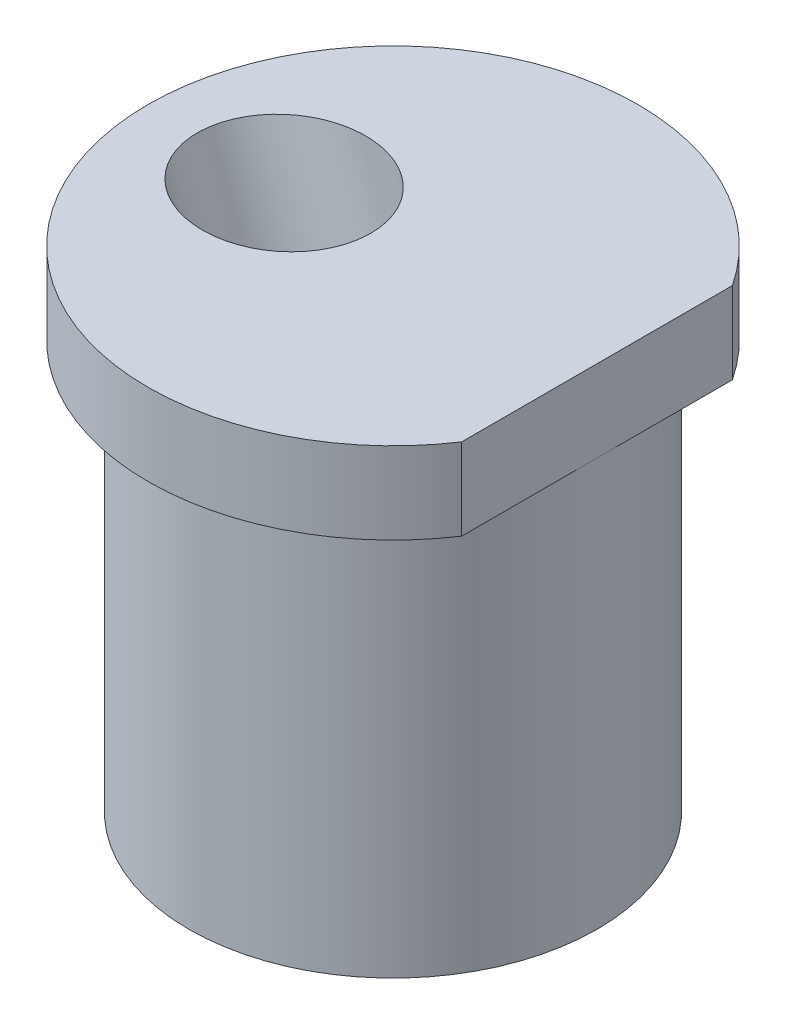
ISO-10303-21;
HEADER;
FILE_DESCRIPTION(('STEP AP214'),'2;1');
FILE_NAME('part.step','',(''),(''),'','','');
FILE_SCHEMA(('AUTOMOTIVE_DESIGN { 1 0 10303 214 1 1 1 1 }'));
ENDSEC;
DATA;
#1=APPLICATION_CONTEXT('core data for automotive mechanical design processes');
#2=APPLICATION_PROTOCOL_DEFINITION('international standard','automotive_design',2000,#1);
#3=PRODUCT_CONTEXT('',#1,'mechanical');
#4=PRODUCT('Part','Part','',(#3));
#5=PRODUCT_RELATED_PRODUCT_CATEGORY('part','',(#4));
#6=PRODUCT_DEFINITION_FORMATION('','',#4);
#7=PRODUCT_DEFINITION_CONTEXT('part definition',#1,'design');
#8=PRODUCT_DEFINITION('design','',#6,#7);
#9=PRODUCT_DEFINITION_SHAPE('','',#8);
#10=(LENGTH_UNIT() NAMED_UNIT(*) SI_UNIT(.MILLI.,.METRE.));
#11=(NAMED_UNIT(*) PLANE_ANGLE_UNIT() SI_UNIT($,.RADIAN.));
#12=(NAMED_UNIT(*) SI_UNIT($,.STERADIAN.) SOLID_ANGLE_UNIT());
#13=UNCERTAINTY_MEASURE_WITH_UNIT(LENGTH_MEASURE(1.E-05),#10,'distance_accuracy_value','');
#14=(GEOMETRIC_REPRESENTATION_CONTEXT(3) GLOBAL_UNCERTAINTY_ASSIGNED_CONTEXT((#13)) GLOBAL_UNIT_ASSIGNED_CONTEXT((#10,
#11,#12)) REPRESENTATION_CONTEXT('',''));
#15=CARTESIAN_POINT('',(0.,0.,0.));
#16=DIRECTION('',(0.,0.,1.));
#17=DIRECTION('',(1.,0.,0.));
#18=AXIS2_PLACEMENT_3D('',#15,#16,#17);
#19=CARTESIAN_POINT('',(0.,0.,0.));
#20=DIRECTION('',(0.,-1.,0.));
#21=DIRECTION('',(0.,0.,-1.));
#22=AXIS2_PLACEMENT_3D('',#19,#20,#21);
#23=PLANE('',#22);
#24=CARTESIAN_POINT('',(8.50000000000001,0.,0.));
#25=DIRECTION('',(0.,-1.,0.));
#26=DIRECTION('',(-1.,0.,0.));
#27=AXIS2_PLACEMENT_3D('',#24,#25,#26);
#28=ELLIPSE('',#27,8.51342217980731,8.);
#29=CARTESIAN_POINT('',(-0.0134221798073,0.,0.));
#30=VERTEX_POINT('',#29);
#31=EDGE_CURVE('E78',#30,#30,#28,.F.);
#32=ORIENTED_EDGE('',*,*,#31,.T.);
#33=EDGE_LOOP('',(#32));
#34=FACE_BOUND('',#33,.T.);
#35=CARTESIAN_POINT('',(0.,0.,0.));
#36=DIRECTION('',(0.,-1.,0.));
#37=DIRECTION('',(0.,0.,-1.));
#38=AXIS2_PLACEMENT_3D('',#35,#36,#37);
#39=CIRCLE('',#38,25.);
#40=CARTESIAN_POINT('',(0.,0.,-25.));
#41=VERTEX_POINT('',#40);
#42=EDGE_CURVE('E81',#41,#41,#39,.T.);
#43=ORIENTED_EDGE('',*,*,#42,.T.);
#44=EDGE_LOOP('',(#43));
#45=FACE_BOUND('',#44,.T.);
#46=ADVANCED_FACE('F37',(#34,#45),#23,.T.);
#47=CARTESIAN_POINT('',(0.,60.,0.));
#48=DIRECTION('',(0.,1.,0.));
#49=DIRECTION('',(0.,0.,1.));
#50=AXIS2_PLACEMENT_3D('',#47,#48,#49);
#51=PLANE('',#50);
#52=CARTESIAN_POINT('',(-13.3334232850949,60.,0.));
#53=DIRECTION('',(0.,1.,0.));
#54=DIRECTION('',(1.,0.,0.));
#55=AXIS2_PLACEMENT_3D('',#52,#53,#54);
#56=ELLIPSE('',#55,10.6417777247592,10.0000000000001);
#57=CARTESIAN_POINT('',(-2.69164556033568,60.,0.));
#58=VERTEX_POINT('',#57);
#59=EDGE_CURVE('E40',#58,#58,#56,.T.);
#60=ORIENTED_EDGE('',*,*,#59,.F.);
#61=EDGE_LOOP('',(#60));
#62=FACE_BOUND('',#61,.T.);
#63=DIRECTION('',(0.,0.,1.));
#64=VECTOR('',#63,1.);
#65=CARTESIAN_POINT('',(25.,60.,-25.7852748942717));
#66=LINE('',#65,#64);
#67=CARTESIAN_POINT('',(25.,60.,-16.583123951777));
#68=VERTEX_POINT('',#67);
#69=CARTESIAN_POINT('',(25.,60.,16.583123951777));
#70=VERTEX_POINT('',#69);
#71=EDGE_CURVE('E69',#68,#70,#66,.T.);
#72=ORIENTED_EDGE('',*,*,#71,.F.);
#73=CARTESIAN_POINT('',(0.,60.,0.));
#74=DIRECTION('',(0.,-1.,0.));
#75=DIRECTION('',(0.,0.,-1.));
#76=AXIS2_PLACEMENT_3D('',#73,#74,#75);
#77=CIRCLE('',#76,30.);
#78=EDGE_CURVE('E11',#70,#68,#77,.T.);
#79=ORIENTED_EDGE('',*,*,#78,.F.);
#80=EDGE_LOOP('',(#72,#79));
#81=FACE_BOUND('',#80,.T.);
#82=ADVANCED_FACE('F77',(#62,#81),#51,.T.);
#83=CARTESIAN_POINT('',(0.,0.,0.));
#84=DIRECTION('',(0.,-1.,0.));
#85=DIRECTION('',(0.,0.,-1.));
#86=AXIS2_PLACEMENT_3D('',#83,#84,#85);
#87=CYLINDRICAL_SURFACE('',#86,30.);
#88=DIRECTION('',(0.,-1.,0.));
#89=VECTOR('',#88,1.);
#90=CARTESIAN_POINT('',(25.,0.,-16.583123951777));
#91=LINE('',#90,#89);
#92=CARTESIAN_POINT('',(25.,50.,-16.583123951777));
#93=VERTEX_POINT('',#92);
#94=EDGE_CURVE('E66',#93,#68,#91,.F.);
#95=ORIENTED_EDGE('',*,*,#94,.F.);
#96=CARTESIAN_POINT('',(0.,50.,0.));
#97=DIRECTION('',(0.,-1.,0.));
#98=DIRECTION('',(0.,0.,-1.));
#99=AXIS2_PLACEMENT_3D('',#96,#97,#98);
#100=CIRCLE('',#99,30.);
#101=CARTESIAN_POINT('',(25.,50.,16.583123951777));
#102=VERTEX_POINT('',#101);
#103=EDGE_CURVE('E45',#102,#93,#100,.T.);
#104=ORIENTED_EDGE('',*,*,#103,.F.);
#105=DIRECTION('',(0.,-1.,0.));
#106=VECTOR('',#105,1.);
#107=CARTESIAN_POINT('',(25.,0.,16.583123951777));
#108=LINE('',#107,#106);
#109=EDGE_CURVE('E58',#70,#102,#108,.T.);
#110=ORIENTED_EDGE('',*,*,#109,.F.);
#111=ORIENTED_EDGE('',*,*,#78,.T.);
#112=EDGE_LOOP('',(#95,#104,#110,#111));
#113=FACE_BOUND('',#112,.T.);
#114=ADVANCED_FACE('F80',(#113),#87,.T.);
#115=CARTESIAN_POINT('',(30.,50.,0.));
#116=DIRECTION('',(0.,-1.,0.));
#117=DIRECTION('',(0.,0.,-1.));
#118=AXIS2_PLACEMENT_3D('',#115,#116,#117);
#119=PLANE('',#118);
#120=DIRECTION('',(0.,0.,-1.));
#121=VECTOR('',#120,1.);
#122=CARTESIAN_POINT('',(25.,50.,0.));
#123=LINE('',#122,#121);
#124=CARTESIAN_POINT('',(25.,50.,0.));
#125=VERTEX_POINT('',#124);
#126=EDGE_CURVE('E53',#102,#125,#123,.T.);
#127=ORIENTED_EDGE('',*,*,#126,.F.);
#128=ORIENTED_EDGE('',*,*,#103,.T.);
#129=EDGE_CURVE('E70',#125,#93,#123,.T.);
#130=ORIENTED_EDGE('',*,*,#129,.F.);
#131=CARTESIAN_POINT('',(0.,50.,0.));
#132=DIRECTION('',(0.,-1.,0.));
#133=DIRECTION('',(0.,0.,-1.));
#134=AXIS2_PLACEMENT_3D('',#131,#132,#133);
#135=CIRCLE('',#134,25.);
#136=EDGE_CURVE('E84',#125,#125,#135,.T.);
#137=ORIENTED_EDGE('',*,*,#136,.F.);
#138=EDGE_LOOP('',(#127,#128,#130,#137));
#139=FACE_BOUND('',#138,.T.);
#140=ADVANCED_FACE('F127',(#139),#119,.T.);
#141=CARTESIAN_POINT('',(0.,0.,0.));
#142=DIRECTION('',(0.,-1.,0.));
#143=DIRECTION('',(0.,0.,-1.));
#144=AXIS2_PLACEMENT_3D('',#141,#142,#143);
#145=CYLINDRICAL_SURFACE('',#144,25.);
#146=ORIENTED_EDGE('',*,*,#136,.T.);
#147=EDGE_LOOP('',(#146));
#148=FACE_BOUND('',#147,.T.);
#149=ORIENTED_EDGE('',*,*,#42,.F.);
#150=EDGE_LOOP('',(#149));
#151=FACE_BOUND('',#150,.T.);
#152=ADVANCED_FACE('F117',(#148,#151),#145,.T.);
#153=CARTESIAN_POINT('',(25.,42.,-25.7852748942717));
#154=DIRECTION('',(-1.,0.,0.));
#155=DIRECTION('',(0.,0.,1.));
#156=AXIS2_PLACEMENT_3D('',#153,#154,#155);
#157=PLANE('',#156);
#158=ORIENTED_EDGE('',*,*,#109,.T.);
#159=ORIENTED_EDGE('',*,*,#126,.T.);
#160=ORIENTED_EDGE('',*,*,#129,.T.);
#161=ORIENTED_EDGE('',*,*,#94,.T.);
#162=ORIENTED_EDGE('',*,*,#71,.T.);
#163=EDGE_LOOP('',(#158,#159,#160,#161,#162));
#164=FACE_BOUND('',#163,.T.);
#165=ADVANCED_FACE('F68',(#164),#157,.F.);
#166=CARTESIAN_POINT('',(-23.7566789948321,88.6244971648963,0.));
#167=DIRECTION('',(-0.342020143325673,0.939692620785907,0.));
#168=DIRECTION('',(-0.939692620785907,-0.342020143325673,0.));
#169=AXIS2_PLACEMENT_3D('',#166,#167,#168);
#170=CYLINDRICAL_SURFACE('',#169,8.);
#171=CARTESIAN_POINT('',(-9.01391101292474,48.1190750343477,0.));
#172=DIRECTION('',(0.342020143325673,-0.939692620785907,0.));
#173=DIRECTION('',(0.939692620785907,0.342020143325673,0.));
#174=AXIS2_PLACEMENT_3D('',#171,#172,#173);
#175=CIRCLE('',#174,8.);
#176=CARTESIAN_POINT('',(-1.49637004663748,50.8552361809531,0.));
#177=VERTEX_POINT('',#176);
#178=EDGE_CURVE('E90',#177,#177,#175,.T.);
#179=ORIENTED_EDGE('',*,*,#178,.F.);
#180=EDGE_LOOP('',(#179));
#181=FACE_BOUND('',#180,.T.);
#182=ORIENTED_EDGE('',*,*,#31,.F.);
#183=EDGE_LOOP('',(#182));
#184=FACE_BOUND('',#183,.T.);
#185=ADVANCED_FACE('F106',(#181,#184),#170,.F.);
#186=CARTESIAN_POINT('',(-9.00968065578148,48.1206147584282,0.));
#187=DIRECTION('',(0.342020143325673,-0.939692620785907,0.));
#188=DIRECTION('',(0.939692620785907,0.342020143325673,0.));
#189=AXIS2_PLACEMENT_3D('',#186,#187,#188);
#190=PLANE('',#189);
#191=ORIENTED_EDGE('',*,*,#178,.T.);
#192=EDGE_LOOP('',(#191));
#193=FACE_BOUND('',#192,.T.);
#194=CARTESIAN_POINT('',(-9.00968065578147,48.1206147584281,0.));
#195=DIRECTION('',(0.342020143325673,-0.939692620785907,0.));
#196=DIRECTION('',(0.939692620785907,0.342020143325673,0.));
#197=AXIS2_PLACEMENT_3D('',#194,#195,#196);
#198=CIRCLE('',#197,10.0000000000001);
#199=CARTESIAN_POINT('',(0.387245552077666,51.5408161916849,0.));
#200=VERTEX_POINT('',#199);
#201=EDGE_CURVE('E92',#200,#200,#198,.T.);
#202=ORIENTED_EDGE('',*,*,#201,.F.);
#203=EDGE_LOOP('',(#202));
#204=FACE_BOUND('',#203,.T.);
#205=ADVANCED_FACE('F108',(#193,#204),#190,.F.);
#206=CARTESIAN_POINT('',(-9.69372094243283,50.,0.));
#207=DIRECTION('',(0.342020143325673,-0.939692620785907,0.));
#208=DIRECTION('',(0.939692620785907,0.342020143325673,0.));
#209=AXIS2_PLACEMENT_3D('',#206,#207,#208);
#210=CYLINDRICAL_SURFACE('',#209,10.0000000000001);
#211=ORIENTED_EDGE('',*,*,#59,.T.);
#212=EDGE_LOOP('',(#211));
#213=FACE_BOUND('',#212,.T.);
#214=ORIENTED_EDGE('',*,*,#201,.T.);
#215=EDGE_LOOP('',(#214));
#216=FACE_BOUND('',#215,.T.);
#217=ADVANCED_FACE('F115',(#213,#216),#210,.F.);
#218=CLOSED_SHELL('',(#46,#82,#114,#140,#152,#165,#185,#205,#217));
#219=MANIFOLD_SOLID_BREP('B2',#218);
#220=ADVANCED_BREP_SHAPE_REPRESENTATION('',(#18,#219),#14);
#221=SHAPE_DEFINITION_REPRESENTATION(#9,#220);
ENDSEC;
END-ISO-10303-21;
